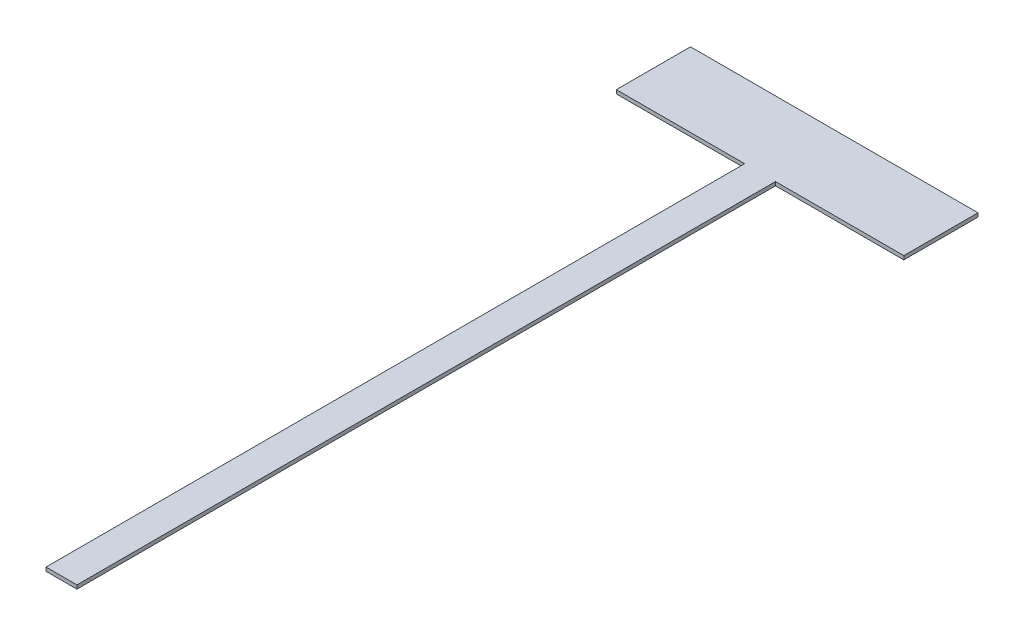
ISO-10303-21;
HEADER;
FILE_DESCRIPTION(('STEP AP214'),'2;1');
FILE_NAME('part.step','',(''),(''),'','','');
FILE_SCHEMA(('AUTOMOTIVE_DESIGN { 1 0 10303 214 1 1 1 1 }'));
ENDSEC;
DATA;
#1=APPLICATION_CONTEXT('core data for automotive mechanical design processes');
#2=APPLICATION_PROTOCOL_DEFINITION('international standard','automotive_design',2000,#1);
#3=PRODUCT_CONTEXT('',#1,'mechanical');
#4=PRODUCT('Part','Part','',(#3));
#5=PRODUCT_RELATED_PRODUCT_CATEGORY('part','',(#4));
#6=PRODUCT_DEFINITION_FORMATION('','',#4);
#7=PRODUCT_DEFINITION_CONTEXT('part definition',#1,'design');
#8=PRODUCT_DEFINITION('design','',#6,#7);
#9=PRODUCT_DEFINITION_SHAPE('','',#8);
#10=(LENGTH_UNIT() NAMED_UNIT(*) SI_UNIT(.MILLI.,.METRE.));
#11=(NAMED_UNIT(*) PLANE_ANGLE_UNIT() SI_UNIT($,.RADIAN.));
#12=(NAMED_UNIT(*) SI_UNIT($,.STERADIAN.) SOLID_ANGLE_UNIT());
#13=UNCERTAINTY_MEASURE_WITH_UNIT(LENGTH_MEASURE(1.E-05),#10,'distance_accuracy_value','');
#14=(GEOMETRIC_REPRESENTATION_CONTEXT(3) GLOBAL_UNCERTAINTY_ASSIGNED_CONTEXT((#13)) GLOBAL_UNIT_ASSIGNED_CONTEXT((#10,
#11,#12)) REPRESENTATION_CONTEXT('',''));
#15=CARTESIAN_POINT('',(0.,0.,0.));
#16=DIRECTION('',(0.,0.,1.));
#17=DIRECTION('',(1.,0.,0.));
#18=AXIS2_PLACEMENT_3D('',#15,#16,#17);
#19=CARTESIAN_POINT('',(46.5,1.2,-24.));
#20=DIRECTION('',(0.,0.,1.));
#21=DIRECTION('',(1.,0.,0.));
#22=AXIS2_PLACEMENT_3D('',#19,#20,#21);
#23=PLANE('',#22);
#24=DIRECTION('',(-1.,0.,0.));
#25=VECTOR('',#24,1.);
#26=CARTESIAN_POINT('',(46.5,0.,-24.));
#27=LINE('',#26,#25);
#28=CARTESIAN_POINT('',(46.5,0.,-24.));
#29=VERTEX_POINT('',#28);
#30=CARTESIAN_POINT('',(-46.5,0.,-24.));
#31=VERTEX_POINT('',#30);
#32=EDGE_CURVE('E135',#29,#31,#27,.T.);
#33=ORIENTED_EDGE('',*,*,#32,.T.);
#34=DIRECTION('',(0.,-1.,0.));
#35=VECTOR('',#34,1.);
#36=CARTESIAN_POINT('',(-46.5,1.2,-24.));
#37=LINE('',#36,#35);
#38=CARTESIAN_POINT('',(-46.5,1.2,-24.));
#39=VERTEX_POINT('',#38);
#40=EDGE_CURVE('E11',#39,#31,#37,.T.);
#41=ORIENTED_EDGE('',*,*,#40,.F.);
#42=DIRECTION('',(-1.,0.,0.));
#43=VECTOR('',#42,1.);
#44=CARTESIAN_POINT('',(46.5,1.2,-24.));
#45=LINE('',#44,#43);
#46=CARTESIAN_POINT('',(46.5,1.2,-24.));
#47=VERTEX_POINT('',#46);
#48=EDGE_CURVE('E149',#47,#39,#45,.T.);
#49=ORIENTED_EDGE('',*,*,#48,.F.);
#50=DIRECTION('',(0.,-1.,0.));
#51=VECTOR('',#50,1.);
#52=CARTESIAN_POINT('',(46.5,1.2,-24.));
#53=LINE('',#52,#51);
#54=EDGE_CURVE('E131',#47,#29,#53,.T.);
#55=ORIENTED_EDGE('',*,*,#54,.T.);
#56=EDGE_LOOP('',(#33,#41,#49,#55));
#57=FACE_BOUND('',#56,.T.);
#58=ADVANCED_FACE('F39',(#57),#23,.F.);
#59=CARTESIAN_POINT('',(-46.5,1.2,-24.));
#60=DIRECTION('',(1.,0.,0.));
#61=DIRECTION('',(0.,0.,-1.));
#62=AXIS2_PLACEMENT_3D('',#59,#60,#61);
#63=PLANE('',#62);
#64=DIRECTION('',(0.,0.,1.));
#65=VECTOR('',#64,1.);
#66=CARTESIAN_POINT('',(-46.5,0.,-24.));
#67=LINE('',#66,#65);
#68=CARTESIAN_POINT('',(-46.5,0.,0.));
#69=VERTEX_POINT('',#68);
#70=EDGE_CURVE('E138',#31,#69,#67,.T.);
#71=ORIENTED_EDGE('',*,*,#70,.T.);
#72=DIRECTION('',(0.,-1.,0.));
#73=VECTOR('',#72,1.);
#74=CARTESIAN_POINT('',(-46.5,1.2,0.));
#75=LINE('',#74,#73);
#76=CARTESIAN_POINT('',(-46.5,1.2,0.));
#77=VERTEX_POINT('',#76);
#78=EDGE_CURVE('E47',#77,#69,#75,.T.);
#79=ORIENTED_EDGE('',*,*,#78,.F.);
#80=DIRECTION('',(0.,0.,1.));
#81=VECTOR('',#80,1.);
#82=CARTESIAN_POINT('',(-46.5,1.2,-24.));
#83=LINE('',#82,#81);
#84=EDGE_CURVE('E98',#39,#77,#83,.T.);
#85=ORIENTED_EDGE('',*,*,#84,.F.);
#86=ORIENTED_EDGE('',*,*,#40,.T.);
#87=EDGE_LOOP('',(#71,#79,#85,#86));
#88=FACE_BOUND('',#87,.T.);
#89=ADVANCED_FACE('F184',(#88),#63,.F.);
#90=CARTESIAN_POINT('',(-46.5,1.2,0.));
#91=DIRECTION('',(0.,0.,-1.));
#92=DIRECTION('',(-1.,0.,0.));
#93=AXIS2_PLACEMENT_3D('',#90,#91,#92);
#94=PLANE('',#93);
#95=DIRECTION('',(1.,0.,0.));
#96=VECTOR('',#95,1.);
#97=CARTESIAN_POINT('',(-46.5,0.,0.));
#98=LINE('',#97,#96);
#99=CARTESIAN_POINT('',(-5.00000000000003,0.,0.));
#100=VERTEX_POINT('',#99);
#101=EDGE_CURVE('E140',#69,#100,#98,.T.);
#102=ORIENTED_EDGE('',*,*,#101,.T.);
#103=DIRECTION('',(0.,-1.,0.));
#104=VECTOR('',#103,1.);
#105=CARTESIAN_POINT('',(-5.00000000000003,1.2,0.));
#106=LINE('',#105,#104);
#107=CARTESIAN_POINT('',(-5.00000000000003,1.2,0.));
#108=VERTEX_POINT('',#107);
#109=EDGE_CURVE('E156',#108,#100,#106,.T.);
#110=ORIENTED_EDGE('',*,*,#109,.F.);
#111=DIRECTION('',(1.,0.,0.));
#112=VECTOR('',#111,1.);
#113=CARTESIAN_POINT('',(-46.5,1.2,0.));
#114=LINE('',#113,#112);
#115=EDGE_CURVE('E164',#77,#108,#114,.T.);
#116=ORIENTED_EDGE('',*,*,#115,.F.);
#117=ORIENTED_EDGE('',*,*,#78,.T.);
#118=EDGE_LOOP('',(#102,#110,#116,#117));
#119=FACE_BOUND('',#118,.T.);
#120=ADVANCED_FACE('F162',(#119),#94,.F.);
#121=CARTESIAN_POINT('',(-5.00000000000003,1.2,0.));
#122=DIRECTION('',(1.,0.,0.));
#123=DIRECTION('',(0.,0.,-1.));
#124=AXIS2_PLACEMENT_3D('',#121,#122,#123);
#125=PLANE('',#124);
#126=DIRECTION('',(0.,0.,1.));
#127=VECTOR('',#126,1.);
#128=CARTESIAN_POINT('',(-5.00000000000003,0.,0.));
#129=LINE('',#128,#127);
#130=CARTESIAN_POINT('',(-5.,0.,226.));
#131=VERTEX_POINT('',#130);
#132=EDGE_CURVE('E142',#100,#131,#129,.T.);
#133=ORIENTED_EDGE('',*,*,#132,.T.);
#134=DIRECTION('',(0.,-1.,0.));
#135=VECTOR('',#134,1.);
#136=CARTESIAN_POINT('',(-5.,1.2,226.));
#137=LINE('',#136,#135);
#138=CARTESIAN_POINT('',(-5.,1.2,226.));
#139=VERTEX_POINT('',#138);
#140=EDGE_CURVE('E153',#139,#131,#137,.T.);
#141=ORIENTED_EDGE('',*,*,#140,.F.);
#142=DIRECTION('',(0.,0.,1.));
#143=VECTOR('',#142,1.);
#144=CARTESIAN_POINT('',(-5.00000000000003,1.2,0.));
#145=LINE('',#144,#143);
#146=EDGE_CURVE('E176',#108,#139,#145,.T.);
#147=ORIENTED_EDGE('',*,*,#146,.F.);
#148=ORIENTED_EDGE('',*,*,#109,.T.);
#149=EDGE_LOOP('',(#133,#141,#147,#148));
#150=FACE_BOUND('',#149,.T.);
#151=ADVANCED_FACE('F172',(#150),#125,.F.);
#152=CARTESIAN_POINT('',(-5.,1.2,226.));
#153=DIRECTION('',(0.,0.,-1.));
#154=DIRECTION('',(-1.,0.,0.));
#155=AXIS2_PLACEMENT_3D('',#152,#153,#154);
#156=PLANE('',#155);
#157=DIRECTION('',(1.,0.,0.));
#158=VECTOR('',#157,1.);
#159=CARTESIAN_POINT('',(-5.,0.,226.));
#160=LINE('',#159,#158);
#161=CARTESIAN_POINT('',(5.,0.,226.));
#162=VERTEX_POINT('',#161);
#163=EDGE_CURVE('E144',#131,#162,#160,.T.);
#164=ORIENTED_EDGE('',*,*,#163,.T.);
#165=DIRECTION('',(0.,-1.,0.));
#166=VECTOR('',#165,1.);
#167=CARTESIAN_POINT('',(5.,1.2,226.));
#168=LINE('',#167,#166);
#169=CARTESIAN_POINT('',(5.,1.2,226.));
#170=VERTEX_POINT('',#169);
#171=EDGE_CURVE('E126',#170,#162,#168,.T.);
#172=ORIENTED_EDGE('',*,*,#171,.F.);
#173=DIRECTION('',(1.,0.,0.));
#174=VECTOR('',#173,1.);
#175=CARTESIAN_POINT('',(-5.,1.2,226.));
#176=LINE('',#175,#174);
#177=EDGE_CURVE('E117',#139,#170,#176,.T.);
#178=ORIENTED_EDGE('',*,*,#177,.F.);
#179=ORIENTED_EDGE('',*,*,#140,.T.);
#180=EDGE_LOOP('',(#164,#172,#178,#179));
#181=FACE_BOUND('',#180,.T.);
#182=ADVANCED_FACE('F175',(#181),#156,.F.);
#183=CARTESIAN_POINT('',(5.,1.2,226.));
#184=DIRECTION('',(-1.,0.,0.));
#185=DIRECTION('',(0.,0.,1.));
#186=AXIS2_PLACEMENT_3D('',#183,#184,#185);
#187=PLANE('',#186);
#188=DIRECTION('',(0.,0.,-1.));
#189=VECTOR('',#188,1.);
#190=CARTESIAN_POINT('',(5.,0.,226.));
#191=LINE('',#190,#189);
#192=CARTESIAN_POINT('',(5.00000000000003,0.,0.));
#193=VERTEX_POINT('',#192);
#194=EDGE_CURVE('E125',#162,#193,#191,.T.);
#195=ORIENTED_EDGE('',*,*,#194,.T.);
#196=DIRECTION('',(0.,-1.,0.));
#197=VECTOR('',#196,1.);
#198=CARTESIAN_POINT('',(5.00000000000003,1.2,0.));
#199=LINE('',#198,#197);
#200=CARTESIAN_POINT('',(5.00000000000003,1.2,0.));
#201=VERTEX_POINT('',#200);
#202=EDGE_CURVE('E122',#201,#193,#199,.T.);
#203=ORIENTED_EDGE('',*,*,#202,.F.);
#204=DIRECTION('',(0.,0.,-1.));
#205=VECTOR('',#204,1.);
#206=CARTESIAN_POINT('',(5.,1.2,226.));
#207=LINE('',#206,#205);
#208=EDGE_CURVE('E111',#170,#201,#207,.T.);
#209=ORIENTED_EDGE('',*,*,#208,.F.);
#210=ORIENTED_EDGE('',*,*,#171,.T.);
#211=EDGE_LOOP('',(#195,#203,#209,#210));
#212=FACE_BOUND('',#211,.T.);
#213=ADVANCED_FACE('F123',(#212),#187,.F.);
#214=CARTESIAN_POINT('',(5.00000000000003,1.2,0.));
#215=DIRECTION('',(0.,0.,-1.));
#216=DIRECTION('',(-1.,0.,0.));
#217=AXIS2_PLACEMENT_3D('',#214,#215,#216);
#218=PLANE('',#217);
#219=DIRECTION('',(1.,0.,0.));
#220=VECTOR('',#219,1.);
#221=CARTESIAN_POINT('',(5.00000000000003,0.,0.));
#222=LINE('',#221,#220);
#223=CARTESIAN_POINT('',(46.5,0.,0.));
#224=VERTEX_POINT('',#223);
#225=EDGE_CURVE('E84',#193,#224,#222,.T.);
#226=ORIENTED_EDGE('',*,*,#225,.T.);
#227=DIRECTION('',(0.,-1.,0.));
#228=VECTOR('',#227,1.);
#229=CARTESIAN_POINT('',(46.5,1.2,0.));
#230=LINE('',#229,#228);
#231=CARTESIAN_POINT('',(46.5,1.2,0.));
#232=VERTEX_POINT('',#231);
#233=EDGE_CURVE('E127',#232,#224,#230,.T.);
#234=ORIENTED_EDGE('',*,*,#233,.F.);
#235=DIRECTION('',(1.,0.,0.));
#236=VECTOR('',#235,1.);
#237=CARTESIAN_POINT('',(5.00000000000003,1.2,0.));
#238=LINE('',#237,#236);
#239=EDGE_CURVE('E115',#201,#232,#238,.T.);
#240=ORIENTED_EDGE('',*,*,#239,.F.);
#241=ORIENTED_EDGE('',*,*,#202,.T.);
#242=EDGE_LOOP('',(#226,#234,#240,#241));
#243=FACE_BOUND('',#242,.T.);
#244=ADVANCED_FACE('F129',(#243),#218,.F.);
#245=CARTESIAN_POINT('',(46.5,1.2,0.));
#246=DIRECTION('',(-1.,0.,0.));
#247=DIRECTION('',(0.,0.,1.));
#248=AXIS2_PLACEMENT_3D('',#245,#246,#247);
#249=PLANE('',#248);
#250=DIRECTION('',(0.,0.,-1.));
#251=VECTOR('',#250,1.);
#252=CARTESIAN_POINT('',(46.5,0.,0.));
#253=LINE('',#252,#251);
#254=EDGE_CURVE('E90',#224,#29,#253,.T.);
#255=ORIENTED_EDGE('',*,*,#254,.T.);
#256=ORIENTED_EDGE('',*,*,#54,.F.);
#257=DIRECTION('',(0.,0.,-1.));
#258=VECTOR('',#257,1.);
#259=CARTESIAN_POINT('',(46.5,1.2,0.));
#260=LINE('',#259,#258);
#261=EDGE_CURVE('E55',#232,#47,#260,.T.);
#262=ORIENTED_EDGE('',*,*,#261,.F.);
#263=ORIENTED_EDGE('',*,*,#233,.T.);
#264=EDGE_LOOP('',(#255,#256,#262,#263));
#265=FACE_BOUND('',#264,.T.);
#266=ADVANCED_FACE('F200',(#265),#249,.F.);
#267=CARTESIAN_POINT('',(0.,1.2,0.));
#268=DIRECTION('',(0.,1.,0.));
#269=DIRECTION('',(0.,0.,1.));
#270=AXIS2_PLACEMENT_3D('',#267,#268,#269);
#271=PLANE('',#270);
#272=ORIENTED_EDGE('',*,*,#48,.T.);
#273=ORIENTED_EDGE('',*,*,#84,.T.);
#274=ORIENTED_EDGE('',*,*,#115,.T.);
#275=ORIENTED_EDGE('',*,*,#146,.T.);
#276=ORIENTED_EDGE('',*,*,#177,.T.);
#277=ORIENTED_EDGE('',*,*,#208,.T.);
#278=ORIENTED_EDGE('',*,*,#239,.T.);
#279=ORIENTED_EDGE('',*,*,#261,.T.);
#280=EDGE_LOOP('',(#272,#273,#274,#275,#276,#277,#278,#279));
#281=FACE_BOUND('',#280,.T.);
#282=ADVANCED_FACE('F113',(#281),#271,.T.);
#283=CARTESIAN_POINT('',(0.,0.,0.));
#284=DIRECTION('',(0.,1.,0.));
#285=DIRECTION('',(0.,0.,1.));
#286=AXIS2_PLACEMENT_3D('',#283,#284,#285);
#287=PLANE('',#286);
#288=ORIENTED_EDGE('',*,*,#32,.F.);
#289=ORIENTED_EDGE('',*,*,#254,.F.);
#290=ORIENTED_EDGE('',*,*,#225,.F.);
#291=ORIENTED_EDGE('',*,*,#194,.F.);
#292=ORIENTED_EDGE('',*,*,#163,.F.);
#293=ORIENTED_EDGE('',*,*,#132,.F.);
#294=ORIENTED_EDGE('',*,*,#101,.F.);
#295=ORIENTED_EDGE('',*,*,#70,.F.);
#296=EDGE_LOOP('',(#288,#289,#290,#291,#292,#293,#294,#295));
#297=FACE_BOUND('',#296,.T.);
#298=ADVANCED_FACE('F168',(#297),#287,.F.);
#299=CLOSED_SHELL('',(#58,#89,#120,#151,#182,#213,#244,#266,#282,#298));
#300=MANIFOLD_SOLID_BREP('B2',#299);
#301=ADVANCED_BREP_SHAPE_REPRESENTATION('',(#18,#300),#14);
#302=SHAPE_DEFINITION_REPRESENTATION(#9,#301);
ENDSEC;
END-ISO-10303-21;
